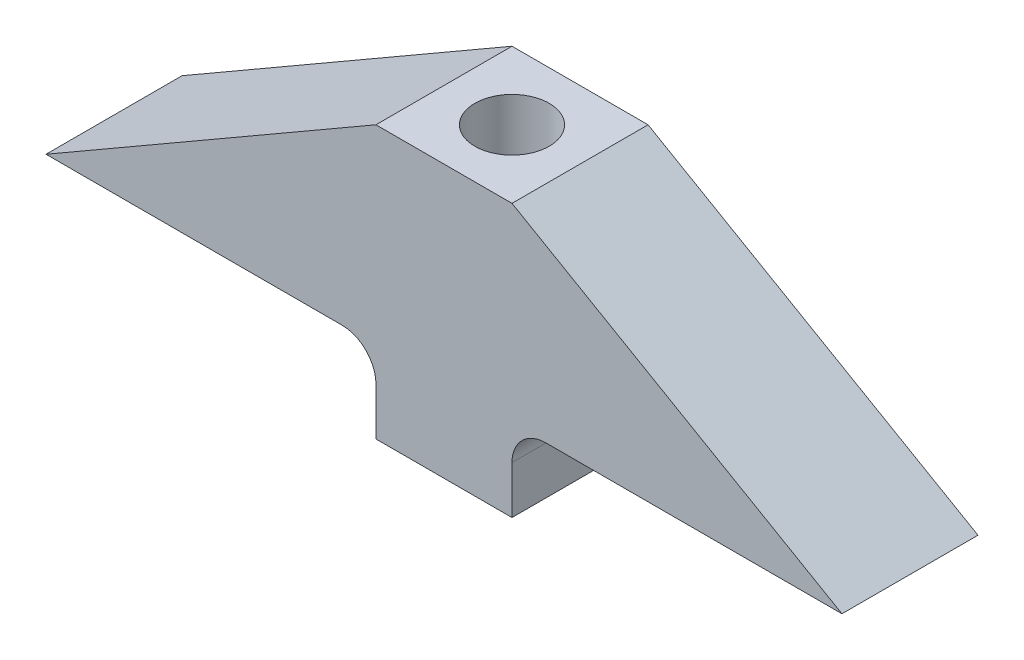
ISO-10303-21;
HEADER;
FILE_DESCRIPTION(('STEP AP214'),'2;1');
FILE_NAME('part.step','',(''),(''),'','','');
FILE_SCHEMA(('AUTOMOTIVE_DESIGN { 1 0 10303 214 1 1 1 1 }'));
ENDSEC;
DATA;
#1=APPLICATION_CONTEXT('core data for automotive mechanical design processes');
#2=APPLICATION_PROTOCOL_DEFINITION('international standard','automotive_design',2000,#1);
#3=PRODUCT_CONTEXT('',#1,'mechanical');
#4=PRODUCT('Part','Part','',(#3));
#5=PRODUCT_RELATED_PRODUCT_CATEGORY('part','',(#4));
#6=PRODUCT_DEFINITION_FORMATION('','',#4);
#7=PRODUCT_DEFINITION_CONTEXT('part definition',#1,'design');
#8=PRODUCT_DEFINITION('design','',#6,#7);
#9=PRODUCT_DEFINITION_SHAPE('','',#8);
#10=(LENGTH_UNIT() NAMED_UNIT(*) SI_UNIT(.MILLI.,.METRE.));
#11=(NAMED_UNIT(*) PLANE_ANGLE_UNIT() SI_UNIT($,.RADIAN.));
#12=(NAMED_UNIT(*) SI_UNIT($,.STERADIAN.) SOLID_ANGLE_UNIT());
#13=UNCERTAINTY_MEASURE_WITH_UNIT(LENGTH_MEASURE(1.E-05),#10,'distance_accuracy_value','');
#14=(GEOMETRIC_REPRESENTATION_CONTEXT(3) GLOBAL_UNCERTAINTY_ASSIGNED_CONTEXT((#13)) GLOBAL_UNIT_ASSIGNED_CONTEXT((#10,
#11,#12)) REPRESENTATION_CONTEXT('',''));
#15=CARTESIAN_POINT('',(0.,0.,0.));
#16=DIRECTION('',(0.,0.,1.));
#17=DIRECTION('',(1.,0.,0.));
#18=AXIS2_PLACEMENT_3D('',#15,#16,#17);
#19=CARTESIAN_POINT('',(61.5917267171501,35.56,25.4));
#20=DIRECTION('',(0.499999999999995,-0.866025403784442,0.));
#21=DIRECTION('',(0.866025403784442,0.499999999999995,0.));
#22=AXIS2_PLACEMENT_3D('',#19,#20,#21);
#23=PLANE('',#22);
#24=DIRECTION('',(-0.866025403784442,-0.499999999999995,0.));
#25=VECTOR('',#24,1.);
#26=CARTESIAN_POINT('',(61.5917267171501,35.56,0.));
#27=LINE('',#26,#25);
#28=CARTESIAN_POINT('',(61.5917267171501,35.56,0.));
#29=VERTEX_POINT('',#28);
#30=CARTESIAN_POINT('',(0.,0.,0.));
#31=VERTEX_POINT('',#30);
#32=EDGE_CURVE('E159',#29,#31,#27,.T.);
#33=ORIENTED_EDGE('',*,*,#32,.T.);
#34=DIRECTION('',(0.,0.,-1.));
#35=VECTOR('',#34,1.);
#36=CARTESIAN_POINT('',(0.,0.,25.4));
#37=LINE('',#36,#35);
#38=CARTESIAN_POINT('',(0.,0.,25.4));
#39=VERTEX_POINT('',#38);
#40=EDGE_CURVE('E231',#39,#31,#37,.T.);
#41=ORIENTED_EDGE('',*,*,#40,.F.);
#42=DIRECTION('',(-0.866025403784442,-0.499999999999995,0.));
#43=VECTOR('',#42,1.);
#44=CARTESIAN_POINT('',(61.5917267171501,35.56,25.4));
#45=LINE('',#44,#43);
#46=CARTESIAN_POINT('',(61.5917267171501,35.56,25.4));
#47=VERTEX_POINT('',#46);
#48=EDGE_CURVE('E160',#47,#39,#45,.T.);
#49=ORIENTED_EDGE('',*,*,#48,.F.);
#50=DIRECTION('',(0.,0.,-1.));
#51=VECTOR('',#50,1.);
#52=CARTESIAN_POINT('',(61.5917267171501,35.56,25.4));
#53=LINE('',#52,#51);
#54=EDGE_CURVE('E187',#47,#29,#53,.T.);
#55=ORIENTED_EDGE('',*,*,#54,.T.);
#56=EDGE_LOOP('',(#33,#41,#49,#55));
#57=FACE_BOUND('',#56,.T.);
#58=ADVANCED_FACE('F43',(#57),#23,.F.);
#59=CARTESIAN_POINT('',(0.,0.,25.4));
#60=DIRECTION('',(0.,1.,0.));
#61=DIRECTION('',(0.,0.,1.));
#62=AXIS2_PLACEMENT_3D('',#59,#60,#61);
#63=PLANE('',#62);
#64=DIRECTION('',(1.,0.,0.));
#65=VECTOR('',#64,1.);
#66=CARTESIAN_POINT('',(0.,0.,0.));
#67=LINE('',#66,#65);
#68=CARTESIAN_POINT('',(55.2417267171501,0.,0.));
#69=VERTEX_POINT('',#68);
#70=EDGE_CURVE('E191',#31,#69,#67,.T.);
#71=ORIENTED_EDGE('',*,*,#70,.T.);
#72=DIRECTION('',(0.,0.,-1.));
#73=VECTOR('',#72,1.);
#74=CARTESIAN_POINT('',(55.2417267171501,0.,25.4));
#75=LINE('',#74,#73);
#76=CARTESIAN_POINT('',(55.2417267171501,0.,25.4));
#77=VERTEX_POINT('',#76);
#78=EDGE_CURVE('E59',#69,#77,#75,.F.);
#79=ORIENTED_EDGE('',*,*,#78,.T.);
#80=DIRECTION('',(1.,0.,0.));
#81=VECTOR('',#80,1.);
#82=CARTESIAN_POINT('',(0.,0.,25.4));
#83=LINE('',#82,#81);
#84=EDGE_CURVE('E164',#39,#77,#83,.T.);
#85=ORIENTED_EDGE('',*,*,#84,.F.);
#86=ORIENTED_EDGE('',*,*,#40,.T.);
#87=EDGE_LOOP('',(#71,#79,#85,#86));
#88=FACE_BOUND('',#87,.T.);
#89=ADVANCED_FACE('F288',(#88),#63,.F.);
#90=CARTESIAN_POINT('',(61.5917267171501,0.,25.4));
#91=DIRECTION('',(1.,0.,0.));
#92=DIRECTION('',(0.,0.,-1.));
#93=AXIS2_PLACEMENT_3D('',#90,#91,#92);
#94=PLANE('',#93);
#95=DIRECTION('',(0.,-1.,0.));
#96=VECTOR('',#95,1.);
#97=CARTESIAN_POINT('',(61.5917267171501,0.,25.4));
#98=LINE('',#97,#96);
#99=CARTESIAN_POINT('',(61.5917267171501,-6.35,25.4));
#100=VERTEX_POINT('',#99);
#101=CARTESIAN_POINT('',(61.5917267171501,-15.24,25.4));
#102=VERTEX_POINT('',#101);
#103=EDGE_CURVE('E168',#100,#102,#98,.T.);
#104=ORIENTED_EDGE('',*,*,#103,.F.);
#105=DIRECTION('',(0.,0.,-1.));
#106=VECTOR('',#105,1.);
#107=CARTESIAN_POINT('',(61.5917267171501,-6.35,0.));
#108=LINE('',#107,#106);
#109=CARTESIAN_POINT('',(61.5917267171501,-6.35,0.));
#110=VERTEX_POINT('',#109);
#111=EDGE_CURVE('E242',#100,#110,#108,.T.);
#112=ORIENTED_EDGE('',*,*,#111,.T.);
#113=DIRECTION('',(0.,-1.,0.));
#114=VECTOR('',#113,1.);
#115=CARTESIAN_POINT('',(61.5917267171501,0.,0.));
#116=LINE('',#115,#114);
#117=CARTESIAN_POINT('',(61.5917267171501,-15.24,0.));
#118=VERTEX_POINT('',#117);
#119=EDGE_CURVE('E194',#110,#118,#116,.T.);
#120=ORIENTED_EDGE('',*,*,#119,.T.);
#121=DIRECTION('',(0.,0.,-1.));
#122=VECTOR('',#121,1.);
#123=CARTESIAN_POINT('',(61.5917267171501,-15.24,25.4));
#124=LINE('',#123,#122);
#125=EDGE_CURVE('E227',#102,#118,#124,.T.);
#126=ORIENTED_EDGE('',*,*,#125,.F.);
#127=EDGE_LOOP('',(#104,#112,#120,#126));
#128=FACE_BOUND('',#127,.T.);
#129=ADVANCED_FACE('F282',(#128),#94,.F.);
#130=CARTESIAN_POINT('',(61.5917267171501,-15.24,25.4));
#131=DIRECTION('',(0.,1.,0.));
#132=DIRECTION('',(0.,0.,1.));
#133=AXIS2_PLACEMENT_3D('',#130,#131,#132);
#134=PLANE('',#133);
#135=CARTESIAN_POINT('',(77.4667267171501,-15.24,15.875));
#136=DIRECTION('',(0.,-1.,0.));
#137=DIRECTION('',(0.,0.,-1.));
#138=AXIS2_PLACEMENT_3D('',#135,#136,#137);
#139=CIRCLE('',#138,2.0193);
#140=CARTESIAN_POINT('',(77.4667267171501,-15.24,13.8557));
#141=VERTEX_POINT('',#140);
#142=EDGE_CURVE('E138',#141,#141,#139,.T.);
#143=ORIENTED_EDGE('',*,*,#142,.F.);
#144=EDGE_LOOP('',(#143));
#145=FACE_BOUND('',#144,.T.);
#146=CARTESIAN_POINT('',(71.1167267171501,-15.24,9.525));
#147=DIRECTION('',(0.,-1.,0.));
#148=DIRECTION('',(0.,0.,-1.));
#149=AXIS2_PLACEMENT_3D('',#146,#147,#148);
#150=CIRCLE('',#149,2.0193);
#151=CARTESIAN_POINT('',(71.1167267171501,-15.24,7.5057));
#152=VERTEX_POINT('',#151);
#153=EDGE_CURVE('E137',#152,#152,#150,.T.);
#154=ORIENTED_EDGE('',*,*,#153,.F.);
#155=EDGE_LOOP('',(#154));
#156=FACE_BOUND('',#155,.T.);
#157=DIRECTION('',(1.,0.,0.));
#158=VECTOR('',#157,1.);
#159=CARTESIAN_POINT('',(61.5917267171501,-15.24,0.));
#160=LINE('',#159,#158);
#161=CARTESIAN_POINT('',(86.9917267171501,-15.24,0.));
#162=VERTEX_POINT('',#161);
#163=EDGE_CURVE('E197',#118,#162,#160,.T.);
#164=ORIENTED_EDGE('',*,*,#163,.T.);
#165=DIRECTION('',(0.,0.,-1.));
#166=VECTOR('',#165,1.);
#167=CARTESIAN_POINT('',(86.9917267171501,-15.24,25.4));
#168=LINE('',#167,#166);
#169=CARTESIAN_POINT('',(86.9917267171501,-15.24,25.4));
#170=VERTEX_POINT('',#169);
#171=EDGE_CURVE('E223',#170,#162,#168,.T.);
#172=ORIENTED_EDGE('',*,*,#171,.F.);
#173=DIRECTION('',(1.,0.,0.));
#174=VECTOR('',#173,1.);
#175=CARTESIAN_POINT('',(61.5917267171501,-15.24,25.4));
#176=LINE('',#175,#174);
#177=EDGE_CURVE('E171',#102,#170,#176,.T.);
#178=ORIENTED_EDGE('',*,*,#177,.F.);
#179=ORIENTED_EDGE('',*,*,#125,.T.);
#180=EDGE_LOOP('',(#164,#172,#178,#179));
#181=FACE_BOUND('',#180,.T.);
#182=ADVANCED_FACE('F278',(#145,#156,#181),#134,.F.);
#183=CARTESIAN_POINT('',(86.9917267171501,-15.24,25.4));
#184=DIRECTION('',(-1.,0.,0.));
#185=DIRECTION('',(0.,0.,1.));
#186=AXIS2_PLACEMENT_3D('',#183,#184,#185);
#187=PLANE('',#186);
#188=DIRECTION('',(0.,1.,0.));
#189=VECTOR('',#188,1.);
#190=CARTESIAN_POINT('',(86.9917267171501,-15.24,0.));
#191=LINE('',#190,#189);
#192=CARTESIAN_POINT('',(86.9917267171501,-6.35,0.));
#193=VERTEX_POINT('',#192);
#194=EDGE_CURVE('E200',#162,#193,#191,.T.);
#195=ORIENTED_EDGE('',*,*,#194,.T.);
#196=DIRECTION('',(0.,0.,-1.));
#197=VECTOR('',#196,1.);
#198=CARTESIAN_POINT('',(86.9917267171501,-6.35,25.4));
#199=LINE('',#198,#197);
#200=CARTESIAN_POINT('',(86.9917267171501,-6.35,25.4));
#201=VERTEX_POINT('',#200);
#202=EDGE_CURVE('E239',#193,#201,#199,.F.);
#203=ORIENTED_EDGE('',*,*,#202,.T.);
#204=DIRECTION('',(0.,1.,0.));
#205=VECTOR('',#204,1.);
#206=CARTESIAN_POINT('',(86.9917267171501,-15.24,25.4));
#207=LINE('',#206,#205);
#208=EDGE_CURVE('E174',#170,#201,#207,.T.);
#209=ORIENTED_EDGE('',*,*,#208,.F.);
#210=ORIENTED_EDGE('',*,*,#171,.T.);
#211=EDGE_LOOP('',(#195,#203,#209,#210));
#212=FACE_BOUND('',#211,.T.);
#213=ADVANCED_FACE('F274',(#212),#187,.F.);
#214=CARTESIAN_POINT('',(86.9917267171501,0.,25.4));
#215=DIRECTION('',(0.,1.,0.));
#216=DIRECTION('',(0.,0.,1.));
#217=AXIS2_PLACEMENT_3D('',#214,#215,#216);
#218=PLANE('',#217);
#219=DIRECTION('',(1.,0.,0.));
#220=VECTOR('',#219,1.);
#221=CARTESIAN_POINT('',(86.9917267171501,0.,25.4));
#222=LINE('',#221,#220);
#223=CARTESIAN_POINT('',(93.3417267171501,0.,25.4));
#224=VERTEX_POINT('',#223);
#225=CARTESIAN_POINT('',(148.5834534343,0.,25.4));
#226=VERTEX_POINT('',#225);
#227=EDGE_CURVE('E178',#224,#226,#222,.T.);
#228=ORIENTED_EDGE('',*,*,#227,.F.);
#229=DIRECTION('',(0.,0.,-1.));
#230=VECTOR('',#229,1.);
#231=CARTESIAN_POINT('',(93.3417267171501,0.,0.));
#232=LINE('',#231,#230);
#233=CARTESIAN_POINT('',(93.3417267171501,0.,0.));
#234=VERTEX_POINT('',#233);
#235=EDGE_CURVE('E235',#224,#234,#232,.T.);
#236=ORIENTED_EDGE('',*,*,#235,.T.);
#237=DIRECTION('',(1.,0.,0.));
#238=VECTOR('',#237,1.);
#239=CARTESIAN_POINT('',(86.9917267171501,0.,0.));
#240=LINE('',#239,#238);
#241=CARTESIAN_POINT('',(148.5834534343,0.,0.));
#242=VERTEX_POINT('',#241);
#243=EDGE_CURVE('E204',#234,#242,#240,.T.);
#244=ORIENTED_EDGE('',*,*,#243,.T.);
#245=DIRECTION('',(0.,0.,-1.));
#246=VECTOR('',#245,1.);
#247=CARTESIAN_POINT('',(148.5834534343,0.,25.4));
#248=LINE('',#247,#246);
#249=EDGE_CURVE('E219',#226,#242,#248,.T.);
#250=ORIENTED_EDGE('',*,*,#249,.F.);
#251=EDGE_LOOP('',(#228,#236,#244,#250));
#252=FACE_BOUND('',#251,.T.);
#253=ADVANCED_FACE('F264',(#252),#218,.F.);
#254=CARTESIAN_POINT('',(148.5834534343,0.,25.4));
#255=DIRECTION('',(-0.499999999999995,-0.866025403784442,0.));
#256=DIRECTION('',(0.866025403784442,-0.499999999999995,0.));
#257=AXIS2_PLACEMENT_3D('',#254,#255,#256);
#258=PLANE('',#257);
#259=DIRECTION('',(-0.866025403784442,0.499999999999995,0.));
#260=VECTOR('',#259,1.);
#261=CARTESIAN_POINT('',(148.5834534343,0.,0.));
#262=LINE('',#261,#260);
#263=CARTESIAN_POINT('',(86.9917267171501,35.56,0.));
#264=VERTEX_POINT('',#263);
#265=EDGE_CURVE('E207',#242,#264,#262,.T.);
#266=ORIENTED_EDGE('',*,*,#265,.T.);
#267=DIRECTION('',(0.,0.,-1.));
#268=VECTOR('',#267,1.);
#269=CARTESIAN_POINT('',(86.9917267171501,35.56,25.4));
#270=LINE('',#269,#268);
#271=CARTESIAN_POINT('',(86.9917267171501,35.56,25.4));
#272=VERTEX_POINT('',#271);
#273=EDGE_CURVE('E215',#272,#264,#270,.T.);
#274=ORIENTED_EDGE('',*,*,#273,.F.);
#275=DIRECTION('',(-0.866025403784442,0.499999999999995,0.));
#276=VECTOR('',#275,1.);
#277=CARTESIAN_POINT('',(148.5834534343,0.,25.4));
#278=LINE('',#277,#276);
#279=EDGE_CURVE('E181',#226,#272,#278,.T.);
#280=ORIENTED_EDGE('',*,*,#279,.F.);
#281=ORIENTED_EDGE('',*,*,#249,.T.);
#282=EDGE_LOOP('',(#266,#274,#280,#281));
#283=FACE_BOUND('',#282,.T.);
#284=ADVANCED_FACE('F297',(#283),#258,.F.);
#285=CARTESIAN_POINT('',(86.9917267171501,35.56,25.4));
#286=DIRECTION('',(0.,-1.,0.));
#287=DIRECTION('',(0.,0.,-1.));
#288=AXIS2_PLACEMENT_3D('',#285,#286,#287);
#289=PLANE('',#288);
#290=CARTESIAN_POINT('',(74.2917267171501,35.56,12.7));
#291=DIRECTION('',(0.,1.,0.));
#292=DIRECTION('',(0.,0.,1.));
#293=AXIS2_PLACEMENT_3D('',#290,#291,#292);
#294=CIRCLE('',#293,6.945376);
#295=CARTESIAN_POINT('',(74.2917267171501,35.56,19.645376));
#296=VERTEX_POINT('',#295);
#297=EDGE_CURVE('E151',#296,#296,#294,.T.);
#298=ORIENTED_EDGE('',*,*,#297,.F.);
#299=EDGE_LOOP('',(#298));
#300=FACE_BOUND('',#299,.T.);
#301=DIRECTION('',(-1.,0.,0.));
#302=VECTOR('',#301,1.);
#303=CARTESIAN_POINT('',(86.9917267171501,35.56,0.));
#304=LINE('',#303,#302);
#305=EDGE_CURVE('E165',#264,#29,#304,.T.);
#306=ORIENTED_EDGE('',*,*,#305,.T.);
#307=ORIENTED_EDGE('',*,*,#54,.F.);
#308=DIRECTION('',(-1.,0.,0.));
#309=VECTOR('',#308,1.);
#310=CARTESIAN_POINT('',(86.9917267171501,35.56,25.4));
#311=LINE('',#310,#309);
#312=EDGE_CURVE('E184',#272,#47,#311,.T.);
#313=ORIENTED_EDGE('',*,*,#312,.F.);
#314=ORIENTED_EDGE('',*,*,#273,.T.);
#315=EDGE_LOOP('',(#306,#307,#313,#314));
#316=FACE_BOUND('',#315,.T.);
#317=ADVANCED_FACE('F293',(#300,#316),#289,.F.);
#318=CARTESIAN_POINT('',(0.,0.,25.4));
#319=DIRECTION('',(0.,0.,1.));
#320=DIRECTION('',(1.,0.,0.));
#321=AXIS2_PLACEMENT_3D('',#318,#319,#320);
#322=PLANE('',#321);
#323=ORIENTED_EDGE('',*,*,#48,.T.);
#324=ORIENTED_EDGE('',*,*,#84,.T.);
#325=CARTESIAN_POINT('',(55.2417267171501,-6.35,25.4));
#326=DIRECTION('',(0.,0.,1.));
#327=DIRECTION('',(1.,0.,0.));
#328=AXIS2_PLACEMENT_3D('',#325,#326,#327);
#329=CIRCLE('',#328,6.35);
#330=EDGE_CURVE('E11',#77,#100,#329,.F.);
#331=ORIENTED_EDGE('',*,*,#330,.T.);
#332=ORIENTED_EDGE('',*,*,#103,.T.);
#333=ORIENTED_EDGE('',*,*,#177,.T.);
#334=ORIENTED_EDGE('',*,*,#208,.T.);
#335=CARTESIAN_POINT('',(93.3417267171501,-6.35,25.4));
#336=DIRECTION('',(0.,0.,1.));
#337=DIRECTION('',(1.,0.,0.));
#338=AXIS2_PLACEMENT_3D('',#335,#336,#337);
#339=CIRCLE('',#338,6.35);
#340=EDGE_CURVE('E251',#201,#224,#339,.F.);
#341=ORIENTED_EDGE('',*,*,#340,.T.);
#342=ORIENTED_EDGE('',*,*,#227,.T.);
#343=ORIENTED_EDGE('',*,*,#279,.T.);
#344=ORIENTED_EDGE('',*,*,#312,.T.);
#345=EDGE_LOOP('',(#323,#324,#331,#332,#333,#334,#341,#342,#343,#344));
#346=FACE_BOUND('',#345,.T.);
#347=ADVANCED_FACE('F257',(#346),#322,.T.);
#348=CARTESIAN_POINT('',(0.,0.,0.));
#349=DIRECTION('',(0.,0.,1.));
#350=DIRECTION('',(1.,0.,0.));
#351=AXIS2_PLACEMENT_3D('',#348,#349,#350);
#352=PLANE('',#351);
#353=ORIENTED_EDGE('',*,*,#32,.F.);
#354=ORIENTED_EDGE('',*,*,#305,.F.);
#355=ORIENTED_EDGE('',*,*,#265,.F.);
#356=ORIENTED_EDGE('',*,*,#243,.F.);
#357=CARTESIAN_POINT('',(93.3417267171501,-6.35,0.));
#358=DIRECTION('',(0.,0.,1.));
#359=DIRECTION('',(1.,0.,0.));
#360=AXIS2_PLACEMENT_3D('',#357,#358,#359);
#361=CIRCLE('',#360,6.35);
#362=EDGE_CURVE('E248',#234,#193,#361,.T.);
#363=ORIENTED_EDGE('',*,*,#362,.T.);
#364=ORIENTED_EDGE('',*,*,#194,.F.);
#365=ORIENTED_EDGE('',*,*,#163,.F.);
#366=ORIENTED_EDGE('',*,*,#119,.F.);
#367=CARTESIAN_POINT('',(55.2417267171501,-6.35,0.));
#368=DIRECTION('',(0.,0.,1.));
#369=DIRECTION('',(1.,0.,0.));
#370=AXIS2_PLACEMENT_3D('',#367,#368,#369);
#371=CIRCLE('',#370,6.35);
#372=EDGE_CURVE('E52',#110,#69,#371,.T.);
#373=ORIENTED_EDGE('',*,*,#372,.T.);
#374=ORIENTED_EDGE('',*,*,#70,.F.);
#375=EDGE_LOOP('',(#353,#354,#355,#356,#363,#364,#365,#366,#373,#374));
#376=FACE_BOUND('',#375,.T.);
#377=ADVANCED_FACE('F270',(#376),#352,.F.);
#378=CARTESIAN_POINT('',(74.2917267171501,0.507999999999981,12.7));
#379=DIRECTION('',(0.,1.,0.));
#380=DIRECTION('',(0.,0.,1.));
#381=AXIS2_PLACEMENT_3D('',#378,#379,#380);
#382=CONICAL_SURFACE('',#381,6.94537599999999,1.02974425867665);
#383=CARTESIAN_POINT('',(74.2917267171501,-3.66520292273919,12.7));
#384=VERTEX_POINT('',#383);
#385=VERTEX_LOOP('',#384);
#386=FACE_BOUND('',#385,.T.);
#387=CARTESIAN_POINT('',(74.2917267171501,0.507999999999981,12.7));
#388=DIRECTION('',(0.,1.,0.));
#389=DIRECTION('',(0.,0.,1.));
#390=AXIS2_PLACEMENT_3D('',#387,#388,#389);
#391=CIRCLE('',#390,6.94537599999999);
#392=CARTESIAN_POINT('',(74.2917267171501,0.507999999999981,19.645376));
#393=VERTEX_POINT('',#392);
#394=EDGE_CURVE('E155',#393,#393,#391,.T.);
#395=ORIENTED_EDGE('',*,*,#394,.T.);
#396=EDGE_LOOP('',(#395));
#397=FACE_BOUND('',#396,.T.);
#398=ADVANCED_FACE('F334',(#386,#397),#382,.F.);
#399=CARTESIAN_POINT('',(74.2917267171501,35.56,12.7));
#400=DIRECTION('',(0.,1.,0.));
#401=DIRECTION('',(0.,0.,1.));
#402=AXIS2_PLACEMENT_3D('',#399,#400,#401);
#403=CYLINDRICAL_SURFACE('',#402,6.945376);
#404=ORIENTED_EDGE('',*,*,#394,.F.);
#405=EDGE_LOOP('',(#404));
#406=FACE_BOUND('',#405,.T.);
#407=ORIENTED_EDGE('',*,*,#297,.T.);
#408=EDGE_LOOP('',(#407));
#409=FACE_BOUND('',#408,.T.);
#410=ADVANCED_FACE('F330',(#406,#409),#403,.F.);
#411=CARTESIAN_POINT('',(71.1167267171501,-6.604,9.525));
#412=DIRECTION('',(0.,-1.,0.));
#413=DIRECTION('',(0.,0.,-1.));
#414=AXIS2_PLACEMENT_3D('',#411,#412,#413);
#415=CONICAL_SURFACE('',#414,2.0193,1.02974425867665);
#416=CARTESIAN_POINT('',(71.1167267171501,-5.39068215199764,9.525));
#417=VERTEX_POINT('',#416);
#418=VERTEX_LOOP('',#417);
#419=FACE_BOUND('',#418,.T.);
#420=CARTESIAN_POINT('',(71.1167267171501,-6.604,9.525));
#421=DIRECTION('',(0.,-1.,0.));
#422=DIRECTION('',(0.,0.,-1.));
#423=AXIS2_PLACEMENT_3D('',#420,#421,#422);
#424=CIRCLE('',#423,2.0193);
#425=CARTESIAN_POINT('',(71.1167267171501,-6.604,7.5057));
#426=VERTEX_POINT('',#425);
#427=EDGE_CURVE('E143',#426,#426,#424,.T.);
#428=ORIENTED_EDGE('',*,*,#427,.T.);
#429=EDGE_LOOP('',(#428));
#430=FACE_BOUND('',#429,.T.);
#431=ADVANCED_FACE('F326',(#419,#430),#415,.F.);
#432=CARTESIAN_POINT('',(71.1167267171501,-15.24,9.525));
#433=DIRECTION('',(0.,-1.,0.));
#434=DIRECTION('',(0.,0.,-1.));
#435=AXIS2_PLACEMENT_3D('',#432,#433,#434);
#436=CYLINDRICAL_SURFACE('',#435,2.0193);
#437=ORIENTED_EDGE('',*,*,#427,.F.);
#438=EDGE_LOOP('',(#437));
#439=FACE_BOUND('',#438,.T.);
#440=ORIENTED_EDGE('',*,*,#153,.T.);
#441=EDGE_LOOP('',(#440));
#442=FACE_BOUND('',#441,.T.);
#443=ADVANCED_FACE('F130',(#439,#442),#436,.F.);
#444=CARTESIAN_POINT('',(77.4667267171501,-6.604,15.875));
#445=DIRECTION('',(0.,-1.,0.));
#446=DIRECTION('',(0.,0.,-1.));
#447=AXIS2_PLACEMENT_3D('',#444,#445,#446);
#448=CONICAL_SURFACE('',#447,2.0193,1.02974425867665);
#449=CARTESIAN_POINT('',(77.4667267171501,-5.39068215199764,15.875));
#450=VERTEX_POINT('',#449);
#451=VERTEX_LOOP('',#450);
#452=FACE_BOUND('',#451,.T.);
#453=CARTESIAN_POINT('',(77.4667267171501,-6.604,15.875));
#454=DIRECTION('',(0.,-1.,0.));
#455=DIRECTION('',(0.,0.,-1.));
#456=AXIS2_PLACEMENT_3D('',#453,#454,#455);
#457=CIRCLE('',#456,2.0193);
#458=CARTESIAN_POINT('',(77.4667267171501,-6.604,13.8557));
#459=VERTEX_POINT('',#458);
#460=EDGE_CURVE('E134',#459,#459,#457,.T.);
#461=ORIENTED_EDGE('',*,*,#460,.T.);
#462=EDGE_LOOP('',(#461));
#463=FACE_BOUND('',#462,.T.);
#464=ADVANCED_FACE('F126',(#452,#463),#448,.F.);
#465=CARTESIAN_POINT('',(77.4667267171501,-15.24,15.875));
#466=DIRECTION('',(0.,-1.,0.));
#467=DIRECTION('',(0.,0.,-1.));
#468=AXIS2_PLACEMENT_3D('',#465,#466,#467);
#469=CYLINDRICAL_SURFACE('',#468,2.0193);
#470=ORIENTED_EDGE('',*,*,#460,.F.);
#471=EDGE_LOOP('',(#470));
#472=FACE_BOUND('',#471,.T.);
#473=ORIENTED_EDGE('',*,*,#142,.T.);
#474=EDGE_LOOP('',(#473));
#475=FACE_BOUND('',#474,.T.);
#476=ADVANCED_FACE('F129',(#472,#475),#469,.F.);
#477=CARTESIAN_POINT('',(93.3417267171501,-6.35,25.4));
#478=DIRECTION('',(0.,0.,1.));
#479=DIRECTION('',(1.,0.,0.));
#480=AXIS2_PLACEMENT_3D('',#477,#478,#479);
#481=CYLINDRICAL_SURFACE('',#480,6.35);
#482=ORIENTED_EDGE('',*,*,#340,.F.);
#483=ORIENTED_EDGE('',*,*,#202,.F.);
#484=ORIENTED_EDGE('',*,*,#362,.F.);
#485=ORIENTED_EDGE('',*,*,#235,.F.);
#486=EDGE_LOOP('',(#482,#483,#484,#485));
#487=FACE_BOUND('',#486,.T.);
#488=ADVANCED_FACE('F267',(#487),#481,.F.);
#489=CARTESIAN_POINT('',(55.2417267171501,-6.35,25.4));
#490=DIRECTION('',(0.,0.,1.));
#491=DIRECTION('',(1.,0.,0.));
#492=AXIS2_PLACEMENT_3D('',#489,#490,#491);
#493=CYLINDRICAL_SURFACE('',#492,6.35);
#494=ORIENTED_EDGE('',*,*,#330,.F.);
#495=ORIENTED_EDGE('',*,*,#78,.F.);
#496=ORIENTED_EDGE('',*,*,#372,.F.);
#497=ORIENTED_EDGE('',*,*,#111,.F.);
#498=EDGE_LOOP('',(#494,#495,#496,#497));
#499=FACE_BOUND('',#498,.T.);
#500=ADVANCED_FACE('F45',(#499),#493,.F.);
#501=CLOSED_SHELL('',(#58,#89,#129,#182,#213,#253,#284,#317,#347,#377,#398,#410,#431,#443,#464,
#476,#488,#500));
#502=MANIFOLD_SOLID_BREP('B2',#501);
#503=ADVANCED_BREP_SHAPE_REPRESENTATION('',(#18,#502),#14);
#504=SHAPE_DEFINITION_REPRESENTATION(#9,#503);
ENDSEC;
END-ISO-10303-21;
